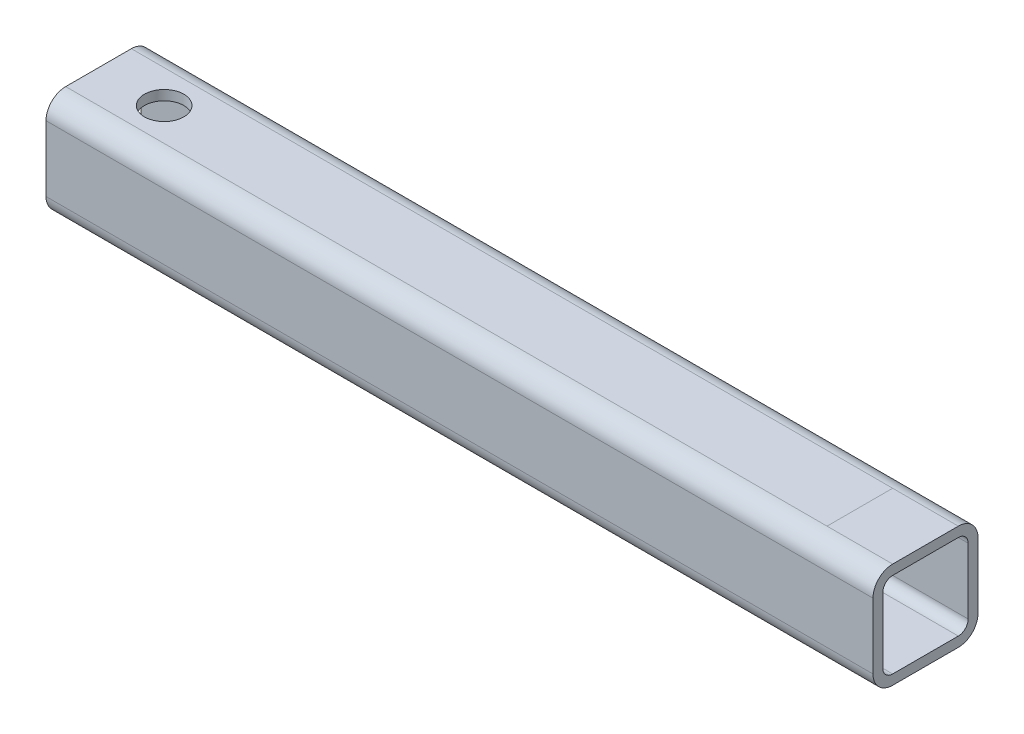
ISO-10303-21;
HEADER;
FILE_DESCRIPTION(('STEP AP214'),'2;1');
FILE_NAME('part.step','',(''),(''),'','','');
FILE_SCHEMA(('AUTOMOTIVE_DESIGN { 1 0 10303 214 1 1 1 1 }'));
ENDSEC;
DATA;
#1=APPLICATION_CONTEXT('core data for automotive mechanical design processes');
#2=APPLICATION_PROTOCOL_DEFINITION('international standard','automotive_design',2000,#1);
#3=PRODUCT_CONTEXT('',#1,'mechanical');
#4=PRODUCT('Part','Part','',(#3));
#5=PRODUCT_RELATED_PRODUCT_CATEGORY('part','',(#4));
#6=PRODUCT_DEFINITION_FORMATION('','',#4);
#7=PRODUCT_DEFINITION_CONTEXT('part definition',#1,'design');
#8=PRODUCT_DEFINITION('design','',#6,#7);
#9=PRODUCT_DEFINITION_SHAPE('','',#8);
#10=(LENGTH_UNIT() NAMED_UNIT(*) SI_UNIT(.MILLI.,.METRE.));
#11=(NAMED_UNIT(*) PLANE_ANGLE_UNIT() SI_UNIT($,.RADIAN.));
#12=(NAMED_UNIT(*) SI_UNIT($,.STERADIAN.) SOLID_ANGLE_UNIT());
#13=UNCERTAINTY_MEASURE_WITH_UNIT(LENGTH_MEASURE(1.E-05),#10,'distance_accuracy_value','');
#14=(GEOMETRIC_REPRESENTATION_CONTEXT(3) GLOBAL_UNCERTAINTY_ASSIGNED_CONTEXT((#13)) GLOBAL_UNIT_ASSIGNED_CONTEXT((#10,
#11,#12)) REPRESENTATION_CONTEXT('',''));
#15=CARTESIAN_POINT('',(0.,0.,0.));
#16=DIRECTION('',(0.,0.,1.));
#17=DIRECTION('',(1.,0.,0.));
#18=AXIS2_PLACEMENT_3D('',#15,#16,#17);
#19=CARTESIAN_POINT('',(400.,25.4,15.875));
#20=DIRECTION('',(0.,-1.,0.));
#21=DIRECTION('',(0.,0.,-1.));
#22=AXIS2_PLACEMENT_3D('',#19,#20,#21);
#23=PLANE('',#22);
#24=CARTESIAN_POINT('',(31.75,25.4,0.));
#25=DIRECTION('',(0.,1.,0.));
#26=DIRECTION('',(0.,0.,1.));
#27=AXIS2_PLACEMENT_3D('',#24,#25,#26);
#28=CIRCLE('',#27,9.525);
#29=CARTESIAN_POINT('',(31.75,25.4,9.525));
#30=VERTEX_POINT('',#29);
#31=EDGE_CURVE('E381',#30,#30,#28,.T.);
#32=ORIENTED_EDGE('',*,*,#31,.F.);
#33=EDGE_LOOP('',(#32));
#34=FACE_BOUND('',#33,.T.);
#35=DIRECTION('',(0.,0.,1.));
#36=VECTOR('',#35,1.);
#37=CARTESIAN_POINT('',(368.25,25.4,15.875));
#38=LINE('',#37,#36);
#39=CARTESIAN_POINT('',(368.25,25.4,-15.875));
#40=VERTEX_POINT('',#39);
#41=CARTESIAN_POINT('',(368.25,25.4,15.875));
#42=VERTEX_POINT('',#41);
#43=EDGE_CURVE('E13',#40,#42,#38,.T.);
#44=ORIENTED_EDGE('',*,*,#43,.F.);
#45=DIRECTION('',(-1.,0.,0.));
#46=VECTOR('',#45,1.);
#47=CARTESIAN_POINT('',(400.,25.4,-15.875));
#48=LINE('',#47,#46);
#49=CARTESIAN_POINT('',(0.,25.4,-15.875));
#50=VERTEX_POINT('',#49);
#51=EDGE_CURVE('E336',#40,#50,#48,.T.);
#52=ORIENTED_EDGE('',*,*,#51,.T.);
#53=DIRECTION('',(0.,0.,1.));
#54=VECTOR('',#53,1.);
#55=CARTESIAN_POINT('',(0.,25.4,15.875));
#56=LINE('',#55,#54);
#57=CARTESIAN_POINT('',(0.,25.4,15.875));
#58=VERTEX_POINT('',#57);
#59=EDGE_CURVE('E221',#50,#58,#56,.T.);
#60=ORIENTED_EDGE('',*,*,#59,.T.);
#61=DIRECTION('',(-1.,0.,0.));
#62=VECTOR('',#61,1.);
#63=CARTESIAN_POINT('',(400.,25.4,15.875));
#64=LINE('',#63,#62);
#65=EDGE_CURVE('E208',#42,#58,#64,.T.);
#66=ORIENTED_EDGE('',*,*,#65,.F.);
#67=EDGE_LOOP('',(#44,#52,#60,#66));
#68=FACE_BOUND('',#67,.T.);
#69=ADVANCED_FACE('F80',(#34,#68),#23,.F.);
#70=CARTESIAN_POINT('',(400.,15.875,15.875));
#71=DIRECTION('',(-1.,0.,0.));
#72=DIRECTION('',(0.,0.,1.));
#73=AXIS2_PLACEMENT_3D('',#70,#71,#72);
#74=CYLINDRICAL_SURFACE('',#73,9.525);
#75=CARTESIAN_POINT('',(0.,15.875,15.875));
#76=DIRECTION('',(1.,0.,0.));
#77=DIRECTION('',(0.,0.,-1.));
#78=AXIS2_PLACEMENT_3D('',#75,#76,#77);
#79=CIRCLE('',#78,9.525);
#80=CARTESIAN_POINT('',(0.,15.875,25.4));
#81=VERTEX_POINT('',#80);
#82=EDGE_CURVE('E306',#58,#81,#79,.T.);
#83=ORIENTED_EDGE('',*,*,#82,.T.);
#84=DIRECTION('',(-1.,0.,0.));
#85=VECTOR('',#84,1.);
#86=CARTESIAN_POINT('',(400.,15.875,25.4));
#87=LINE('',#86,#85);
#88=CARTESIAN_POINT('',(400.,15.875,25.4));
#89=VERTEX_POINT('',#88);
#90=EDGE_CURVE('E89',#89,#81,#87,.T.);
#91=ORIENTED_EDGE('',*,*,#90,.F.);
#92=CARTESIAN_POINT('',(400.,15.875,15.875));
#93=DIRECTION('',(1.,0.,0.));
#94=DIRECTION('',(0.,0.,-1.));
#95=AXIS2_PLACEMENT_3D('',#92,#93,#94);
#96=CIRCLE('',#95,9.525);
#97=CARTESIAN_POINT('',(400.,25.4,15.875));
#98=VERTEX_POINT('',#97);
#99=EDGE_CURVE('E250',#98,#89,#96,.T.);
#100=ORIENTED_EDGE('',*,*,#99,.F.);
#101=EDGE_CURVE('E332',#98,#42,#64,.T.);
#102=ORIENTED_EDGE('',*,*,#101,.T.);
#103=ORIENTED_EDGE('',*,*,#65,.T.);
#104=EDGE_LOOP('',(#83,#91,#100,#102,#103));
#105=FACE_BOUND('',#104,.T.);
#106=ADVANCED_FACE('F431',(#105),#74,.T.);
#107=CARTESIAN_POINT('',(400.,15.875,25.4));
#108=DIRECTION('',(0.,0.,-1.));
#109=DIRECTION('',(0.,1.,0.));
#110=AXIS2_PLACEMENT_3D('',#107,#108,#109);
#111=PLANE('',#110);
#112=DIRECTION('',(0.,-1.,0.));
#113=VECTOR('',#112,1.);
#114=CARTESIAN_POINT('',(0.,15.875,25.4));
#115=LINE('',#114,#113);
#116=CARTESIAN_POINT('',(0.,-15.875,25.4));
#117=VERTEX_POINT('',#116);
#118=EDGE_CURVE('E310',#81,#117,#115,.T.);
#119=ORIENTED_EDGE('',*,*,#118,.T.);
#120=DIRECTION('',(-1.,0.,0.));
#121=VECTOR('',#120,1.);
#122=CARTESIAN_POINT('',(400.,-15.875,25.4));
#123=LINE('',#122,#121);
#124=CARTESIAN_POINT('',(400.,-15.875,25.4));
#125=VERTEX_POINT('',#124);
#126=EDGE_CURVE('E356',#125,#117,#123,.T.);
#127=ORIENTED_EDGE('',*,*,#126,.F.);
#128=DIRECTION('',(0.,-1.,0.));
#129=VECTOR('',#128,1.);
#130=CARTESIAN_POINT('',(400.,15.875,25.4));
#131=LINE('',#130,#129);
#132=EDGE_CURVE('E254',#89,#125,#131,.T.);
#133=ORIENTED_EDGE('',*,*,#132,.F.);
#134=ORIENTED_EDGE('',*,*,#90,.T.);
#135=EDGE_LOOP('',(#119,#127,#133,#134));
#136=FACE_BOUND('',#135,.T.);
#137=ADVANCED_FACE('F437',(#136),#111,.F.);
#138=CARTESIAN_POINT('',(400.,-15.875,15.875));
#139=DIRECTION('',(-1.,0.,0.));
#140=DIRECTION('',(0.,0.,1.));
#141=AXIS2_PLACEMENT_3D('',#138,#139,#140);
#142=CYLINDRICAL_SURFACE('',#141,9.525);
#143=CARTESIAN_POINT('',(0.,-15.875,15.875));
#144=DIRECTION('',(1.,0.,0.));
#145=DIRECTION('',(0.,0.,-1.));
#146=AXIS2_PLACEMENT_3D('',#143,#144,#145);
#147=CIRCLE('',#146,9.525);
#148=CARTESIAN_POINT('',(0.,-25.4,15.875));
#149=VERTEX_POINT('',#148);
#150=EDGE_CURVE('E313',#117,#149,#147,.T.);
#151=ORIENTED_EDGE('',*,*,#150,.T.);
#152=DIRECTION('',(-1.,0.,0.));
#153=VECTOR('',#152,1.);
#154=CARTESIAN_POINT('',(400.,-25.4,15.875));
#155=LINE('',#154,#153);
#156=CARTESIAN_POINT('',(400.,-25.4,15.875));
#157=VERTEX_POINT('',#156);
#158=EDGE_CURVE('E352',#157,#149,#155,.T.);
#159=ORIENTED_EDGE('',*,*,#158,.F.);
#160=CARTESIAN_POINT('',(400.,-15.875,15.875));
#161=DIRECTION('',(1.,0.,0.));
#162=DIRECTION('',(0.,0.,-1.));
#163=AXIS2_PLACEMENT_3D('',#160,#161,#162);
#164=CIRCLE('',#163,9.525);
#165=EDGE_CURVE('E257',#125,#157,#164,.T.);
#166=ORIENTED_EDGE('',*,*,#165,.F.);
#167=ORIENTED_EDGE('',*,*,#126,.T.);
#168=EDGE_LOOP('',(#151,#159,#166,#167));
#169=FACE_BOUND('',#168,.T.);
#170=ADVANCED_FACE('F482',(#169),#142,.T.);
#171=CARTESIAN_POINT('',(400.,-25.4,-15.875));
#172=DIRECTION('',(0.,1.,0.));
#173=DIRECTION('',(0.,0.,1.));
#174=AXIS2_PLACEMENT_3D('',#171,#172,#173);
#175=PLANE('',#174);
#176=CARTESIAN_POINT('',(31.75,-25.4,0.));
#177=DIRECTION('',(0.,1.,0.));
#178=DIRECTION('',(0.,0.,1.));
#179=AXIS2_PLACEMENT_3D('',#176,#177,#178);
#180=CIRCLE('',#179,9.525);
#181=CARTESIAN_POINT('',(31.75,-25.4,9.525));
#182=VERTEX_POINT('',#181);
#183=EDGE_CURVE('E380',#182,#182,#180,.T.);
#184=ORIENTED_EDGE('',*,*,#183,.T.);
#185=EDGE_LOOP('',(#184));
#186=FACE_BOUND('',#185,.T.);
#187=DIRECTION('',(0.,0.,-1.));
#188=VECTOR('',#187,1.);
#189=CARTESIAN_POINT('',(0.,-25.4,-15.875));
#190=LINE('',#189,#188);
#191=CARTESIAN_POINT('',(0.,-25.4,-15.875));
#192=VERTEX_POINT('',#191);
#193=EDGE_CURVE('E316',#149,#192,#190,.T.);
#194=ORIENTED_EDGE('',*,*,#193,.T.);
#195=DIRECTION('',(-1.,0.,0.));
#196=VECTOR('',#195,1.);
#197=CARTESIAN_POINT('',(400.,-25.4,-15.875));
#198=LINE('',#197,#196);
#199=CARTESIAN_POINT('',(400.,-25.4,-15.875));
#200=VERTEX_POINT('',#199);
#201=EDGE_CURVE('E348',#200,#192,#198,.T.);
#202=ORIENTED_EDGE('',*,*,#201,.F.);
#203=DIRECTION('',(0.,0.,-1.));
#204=VECTOR('',#203,1.);
#205=CARTESIAN_POINT('',(400.,-25.4,-15.875));
#206=LINE('',#205,#204);
#207=EDGE_CURVE('E260',#157,#200,#206,.T.);
#208=ORIENTED_EDGE('',*,*,#207,.F.);
#209=ORIENTED_EDGE('',*,*,#158,.T.);
#210=EDGE_LOOP('',(#194,#202,#208,#209));
#211=FACE_BOUND('',#210,.T.);
#212=ADVANCED_FACE('F478',(#186,#211),#175,.F.);
#213=CARTESIAN_POINT('',(400.,-15.875,-15.875));
#214=DIRECTION('',(-1.,0.,0.));
#215=DIRECTION('',(0.,0.,1.));
#216=AXIS2_PLACEMENT_3D('',#213,#214,#215);
#217=CYLINDRICAL_SURFACE('',#216,9.52499999999999);
#218=CARTESIAN_POINT('',(0.,-15.875,-15.875));
#219=DIRECTION('',(1.,0.,0.));
#220=DIRECTION('',(0.,0.,-1.));
#221=AXIS2_PLACEMENT_3D('',#218,#219,#220);
#222=CIRCLE('',#221,9.52499999999999);
#223=CARTESIAN_POINT('',(0.,-15.875,-25.4));
#224=VERTEX_POINT('',#223);
#225=EDGE_CURVE('E319',#192,#224,#222,.T.);
#226=ORIENTED_EDGE('',*,*,#225,.T.);
#227=DIRECTION('',(-1.,0.,0.));
#228=VECTOR('',#227,1.);
#229=CARTESIAN_POINT('',(400.,-15.875,-25.4));
#230=LINE('',#229,#228);
#231=CARTESIAN_POINT('',(400.,-15.875,-25.4));
#232=VERTEX_POINT('',#231);
#233=EDGE_CURVE('E344',#232,#224,#230,.T.);
#234=ORIENTED_EDGE('',*,*,#233,.F.);
#235=CARTESIAN_POINT('',(400.,-15.875,-15.875));
#236=DIRECTION('',(1.,0.,0.));
#237=DIRECTION('',(0.,0.,-1.));
#238=AXIS2_PLACEMENT_3D('',#235,#236,#237);
#239=CIRCLE('',#238,9.52499999999999);
#240=EDGE_CURVE('E263',#200,#232,#239,.T.);
#241=ORIENTED_EDGE('',*,*,#240,.F.);
#242=ORIENTED_EDGE('',*,*,#201,.T.);
#243=EDGE_LOOP('',(#226,#234,#241,#242));
#244=FACE_BOUND('',#243,.T.);
#245=ADVANCED_FACE('F474',(#244),#217,.T.);
#246=CARTESIAN_POINT('',(400.,-15.875,-25.4));
#247=DIRECTION('',(0.,0.,1.));
#248=DIRECTION('',(0.,-1.,0.));
#249=AXIS2_PLACEMENT_3D('',#246,#247,#248);
#250=PLANE('',#249);
#251=DIRECTION('',(0.,1.,0.));
#252=VECTOR('',#251,1.);
#253=CARTESIAN_POINT('',(0.,-15.875,-25.4));
#254=LINE('',#253,#252);
#255=CARTESIAN_POINT('',(0.,15.875,-25.4));
#256=VERTEX_POINT('',#255);
#257=EDGE_CURVE('E322',#224,#256,#254,.T.);
#258=ORIENTED_EDGE('',*,*,#257,.T.);
#259=DIRECTION('',(-1.,0.,0.));
#260=VECTOR('',#259,1.);
#261=CARTESIAN_POINT('',(400.,15.875,-25.4));
#262=LINE('',#261,#260);
#263=CARTESIAN_POINT('',(400.,15.875,-25.4));
#264=VERTEX_POINT('',#263);
#265=EDGE_CURVE('E340',#264,#256,#262,.T.);
#266=ORIENTED_EDGE('',*,*,#265,.F.);
#267=DIRECTION('',(0.,1.,0.));
#268=VECTOR('',#267,1.);
#269=CARTESIAN_POINT('',(400.,-15.875,-25.4));
#270=LINE('',#269,#268);
#271=EDGE_CURVE('E266',#232,#264,#270,.T.);
#272=ORIENTED_EDGE('',*,*,#271,.F.);
#273=ORIENTED_EDGE('',*,*,#233,.T.);
#274=EDGE_LOOP('',(#258,#266,#272,#273));
#275=FACE_BOUND('',#274,.T.);
#276=ADVANCED_FACE('F469',(#275),#250,.F.);
#277=CARTESIAN_POINT('',(400.,15.875,-15.875));
#278=DIRECTION('',(-1.,0.,0.));
#279=DIRECTION('',(0.,0.,1.));
#280=AXIS2_PLACEMENT_3D('',#277,#278,#279);
#281=CYLINDRICAL_SURFACE('',#280,9.525);
#282=CARTESIAN_POINT('',(0.,15.875,-15.875));
#283=DIRECTION('',(1.,0.,0.));
#284=DIRECTION('',(0.,0.,-1.));
#285=AXIS2_PLACEMENT_3D('',#282,#283,#284);
#286=CIRCLE('',#285,9.525);
#287=EDGE_CURVE('E325',#256,#50,#286,.T.);
#288=ORIENTED_EDGE('',*,*,#287,.T.);
#289=ORIENTED_EDGE('',*,*,#51,.F.);
#290=CARTESIAN_POINT('',(400.,25.4,-15.875));
#291=VERTEX_POINT('',#290);
#292=EDGE_CURVE('E337',#291,#40,#48,.T.);
#293=ORIENTED_EDGE('',*,*,#292,.F.);
#294=CARTESIAN_POINT('',(400.,15.875,-15.875));
#295=DIRECTION('',(1.,0.,0.));
#296=DIRECTION('',(0.,0.,-1.));
#297=AXIS2_PLACEMENT_3D('',#294,#295,#296);
#298=CIRCLE('',#297,9.525);
#299=EDGE_CURVE('E269',#264,#291,#298,.T.);
#300=ORIENTED_EDGE('',*,*,#299,.F.);
#301=ORIENTED_EDGE('',*,*,#265,.T.);
#302=EDGE_LOOP('',(#288,#289,#293,#300,#301));
#303=FACE_BOUND('',#302,.T.);
#304=ADVANCED_FACE('F454',(#303),#281,.T.);
#305=CARTESIAN_POINT('',(400.,-15.875,15.875));
#306=DIRECTION('',(-1.,0.,0.));
#307=DIRECTION('',(0.,0.,1.));
#308=AXIS2_PLACEMENT_3D('',#305,#306,#307);
#309=CYLINDRICAL_SURFACE('',#308,4.7625);
#310=CARTESIAN_POINT('',(0.,-15.875,15.875));
#311=DIRECTION('',(1.,0.,0.));
#312=DIRECTION('',(0.,0.,-1.));
#313=AXIS2_PLACEMENT_3D('',#310,#311,#312);
#314=CIRCLE('',#313,4.7625);
#315=CARTESIAN_POINT('',(0.,-15.875,20.6375));
#316=VERTEX_POINT('',#315);
#317=CARTESIAN_POINT('',(0.,-20.6375,15.875));
#318=VERTEX_POINT('',#317);
#319=EDGE_CURVE('E202',#316,#318,#314,.T.);
#320=ORIENTED_EDGE('',*,*,#319,.F.);
#321=DIRECTION('',(-1.,0.,0.));
#322=VECTOR('',#321,1.);
#323=CARTESIAN_POINT('',(400.,-15.875,20.6375));
#324=LINE('',#323,#322);
#325=CARTESIAN_POINT('',(400.,-15.875,20.6375));
#326=VERTEX_POINT('',#325);
#327=EDGE_CURVE('E197',#326,#316,#324,.T.);
#328=ORIENTED_EDGE('',*,*,#327,.F.);
#329=CARTESIAN_POINT('',(400.,-15.875,15.875));
#330=DIRECTION('',(1.,0.,0.));
#331=DIRECTION('',(0.,0.,-1.));
#332=AXIS2_PLACEMENT_3D('',#329,#330,#331);
#333=CIRCLE('',#332,4.7625);
#334=CARTESIAN_POINT('',(400.,-20.6375,15.875));
#335=VERTEX_POINT('',#334);
#336=EDGE_CURVE('E199',#326,#335,#333,.T.);
#337=ORIENTED_EDGE('',*,*,#336,.T.);
#338=DIRECTION('',(-1.,0.,0.));
#339=VECTOR('',#338,1.);
#340=CARTESIAN_POINT('',(400.,-20.6375,15.875));
#341=LINE('',#340,#339);
#342=EDGE_CURVE('E275',#335,#318,#341,.T.);
#343=ORIENTED_EDGE('',*,*,#342,.T.);
#344=EDGE_LOOP('',(#320,#328,#337,#343));
#345=FACE_BOUND('',#344,.T.);
#346=ADVANCED_FACE('F82',(#345),#309,.F.);
#347=CARTESIAN_POINT('',(400.,15.875,20.6375));
#348=DIRECTION('',(0.,0.,-1.));
#349=DIRECTION('',(0.,1.,0.));
#350=AXIS2_PLACEMENT_3D('',#347,#348,#349);
#351=PLANE('',#350);
#352=DIRECTION('',(0.,-1.,0.));
#353=VECTOR('',#352,1.);
#354=CARTESIAN_POINT('',(0.,15.875,20.6375));
#355=LINE('',#354,#353);
#356=CARTESIAN_POINT('',(0.,15.875,20.6375));
#357=VERTEX_POINT('',#356);
#358=EDGE_CURVE('E278',#357,#316,#355,.T.);
#359=ORIENTED_EDGE('',*,*,#358,.F.);
#360=DIRECTION('',(-1.,0.,0.));
#361=VECTOR('',#360,1.);
#362=CARTESIAN_POINT('',(400.,15.875,20.6375));
#363=LINE('',#362,#361);
#364=CARTESIAN_POINT('',(400.,15.875,20.6375));
#365=VERTEX_POINT('',#364);
#366=EDGE_CURVE('E209',#365,#357,#363,.T.);
#367=ORIENTED_EDGE('',*,*,#366,.F.);
#368=DIRECTION('',(0.,-1.,0.));
#369=VECTOR('',#368,1.);
#370=CARTESIAN_POINT('',(400.,15.875,20.6375));
#371=LINE('',#370,#369);
#372=EDGE_CURVE('E215',#365,#326,#371,.T.);
#373=ORIENTED_EDGE('',*,*,#372,.T.);
#374=ORIENTED_EDGE('',*,*,#327,.T.);
#375=EDGE_LOOP('',(#359,#367,#373,#374));
#376=FACE_BOUND('',#375,.T.);
#377=ADVANCED_FACE('F223',(#376),#351,.T.);
#378=CARTESIAN_POINT('',(400.,15.875,15.875));
#379=DIRECTION('',(-1.,0.,0.));
#380=DIRECTION('',(0.,0.,1.));
#381=AXIS2_PLACEMENT_3D('',#378,#379,#380);
#382=CYLINDRICAL_SURFACE('',#381,4.7625);
#383=CARTESIAN_POINT('',(0.,15.875,15.875));
#384=DIRECTION('',(1.,0.,0.));
#385=DIRECTION('',(0.,0.,-1.));
#386=AXIS2_PLACEMENT_3D('',#383,#384,#385);
#387=CIRCLE('',#386,4.7625);
#388=CARTESIAN_POINT('',(0.,20.6375,15.875));
#389=VERTEX_POINT('',#388);
#390=EDGE_CURVE('E282',#389,#357,#387,.T.);
#391=ORIENTED_EDGE('',*,*,#390,.F.);
#392=DIRECTION('',(-1.,0.,0.));
#393=VECTOR('',#392,1.);
#394=CARTESIAN_POINT('',(400.,20.6375,15.875));
#395=LINE('',#394,#393);
#396=CARTESIAN_POINT('',(400.,20.6375,15.875));
#397=VERTEX_POINT('',#396);
#398=EDGE_CURVE('E398',#397,#389,#395,.T.);
#399=ORIENTED_EDGE('',*,*,#398,.F.);
#400=CARTESIAN_POINT('',(400.,15.875,15.875));
#401=DIRECTION('',(1.,0.,0.));
#402=DIRECTION('',(0.,0.,-1.));
#403=AXIS2_PLACEMENT_3D('',#400,#401,#402);
#404=CIRCLE('',#403,4.7625);
#405=EDGE_CURVE('E225',#397,#365,#404,.T.);
#406=ORIENTED_EDGE('',*,*,#405,.T.);
#407=ORIENTED_EDGE('',*,*,#366,.T.);
#408=EDGE_LOOP('',(#391,#399,#406,#407));
#409=FACE_BOUND('',#408,.T.);
#410=ADVANCED_FACE('F393',(#409),#382,.F.);
#411=CARTESIAN_POINT('',(400.,20.6375,15.875));
#412=DIRECTION('',(0.,-1.,0.));
#413=DIRECTION('',(0.,0.,-1.));
#414=AXIS2_PLACEMENT_3D('',#411,#412,#413);
#415=PLANE('',#414);
#416=CARTESIAN_POINT('',(31.75,20.6375,0.));
#417=DIRECTION('',(0.,-1.,0.));
#418=DIRECTION('',(0.,0.,-1.));
#419=AXIS2_PLACEMENT_3D('',#416,#417,#418);
#420=CIRCLE('',#419,9.525);
#421=CARTESIAN_POINT('',(31.75,20.6375,9.525));
#422=VERTEX_POINT('',#421);
#423=EDGE_CURVE('E279',#422,#422,#420,.T.);
#424=ORIENTED_EDGE('',*,*,#423,.F.);
#425=EDGE_LOOP('',(#424));
#426=FACE_BOUND('',#425,.T.);
#427=DIRECTION('',(0.,0.,1.));
#428=VECTOR('',#427,1.);
#429=CARTESIAN_POINT('',(0.,20.6375,15.875));
#430=LINE('',#429,#428);
#431=CARTESIAN_POINT('',(0.,20.6375,-15.875));
#432=VERTEX_POINT('',#431);
#433=EDGE_CURVE('E286',#432,#389,#430,.T.);
#434=ORIENTED_EDGE('',*,*,#433,.F.);
#435=DIRECTION('',(-1.,0.,0.));
#436=VECTOR('',#435,1.);
#437=CARTESIAN_POINT('',(400.,20.6375,-15.875));
#438=LINE('',#437,#436);
#439=CARTESIAN_POINT('',(400.,20.6375,-15.875));
#440=VERTEX_POINT('',#439);
#441=EDGE_CURVE('E396',#440,#432,#438,.T.);
#442=ORIENTED_EDGE('',*,*,#441,.F.);
#443=DIRECTION('',(0.,0.,1.));
#444=VECTOR('',#443,1.);
#445=CARTESIAN_POINT('',(400.,20.6375,15.875));
#446=LINE('',#445,#444);
#447=EDGE_CURVE('E230',#440,#397,#446,.T.);
#448=ORIENTED_EDGE('',*,*,#447,.T.);
#449=ORIENTED_EDGE('',*,*,#398,.T.);
#450=EDGE_LOOP('',(#434,#442,#448,#449));
#451=FACE_BOUND('',#450,.T.);
#452=ADVANCED_FACE('F389',(#426,#451),#415,.T.);
#453=CARTESIAN_POINT('',(400.,15.875,-15.875));
#454=DIRECTION('',(-1.,0.,0.));
#455=DIRECTION('',(0.,0.,1.));
#456=AXIS2_PLACEMENT_3D('',#453,#454,#455);
#457=CYLINDRICAL_SURFACE('',#456,4.7625);
#458=CARTESIAN_POINT('',(0.,15.875,-15.875));
#459=DIRECTION('',(1.,0.,0.));
#460=DIRECTION('',(0.,0.,-1.));
#461=AXIS2_PLACEMENT_3D('',#458,#459,#460);
#462=CIRCLE('',#461,4.7625);
#463=CARTESIAN_POINT('',(0.,15.875,-20.6375));
#464=VERTEX_POINT('',#463);
#465=EDGE_CURVE('E290',#464,#432,#462,.T.);
#466=ORIENTED_EDGE('',*,*,#465,.F.);
#467=DIRECTION('',(-1.,0.,0.));
#468=VECTOR('',#467,1.);
#469=CARTESIAN_POINT('',(400.,15.875,-20.6375));
#470=LINE('',#469,#468);
#471=CARTESIAN_POINT('',(400.,15.875,-20.6375));
#472=VERTEX_POINT('',#471);
#473=EDGE_CURVE('E372',#472,#464,#470,.T.);
#474=ORIENTED_EDGE('',*,*,#473,.F.);
#475=CARTESIAN_POINT('',(400.,15.875,-15.875));
#476=DIRECTION('',(1.,0.,0.));
#477=DIRECTION('',(0.,0.,-1.));
#478=AXIS2_PLACEMENT_3D('',#475,#476,#477);
#479=CIRCLE('',#478,4.7625);
#480=EDGE_CURVE('E237',#472,#440,#479,.T.);
#481=ORIENTED_EDGE('',*,*,#480,.T.);
#482=ORIENTED_EDGE('',*,*,#441,.T.);
#483=EDGE_LOOP('',(#466,#474,#481,#482));
#484=FACE_BOUND('',#483,.T.);
#485=ADVANCED_FACE('F392',(#484),#457,.F.);
#486=CARTESIAN_POINT('',(400.,-15.875,-20.6375));
#487=DIRECTION('',(0.,0.,1.));
#488=DIRECTION('',(0.,-1.,0.));
#489=AXIS2_PLACEMENT_3D('',#486,#487,#488);
#490=PLANE('',#489);
#491=DIRECTION('',(0.,1.,0.));
#492=VECTOR('',#491,1.);
#493=CARTESIAN_POINT('',(0.,-15.875,-20.6375));
#494=LINE('',#493,#492);
#495=CARTESIAN_POINT('',(0.,-15.875,-20.6375));
#496=VERTEX_POINT('',#495);
#497=EDGE_CURVE('E294',#496,#464,#494,.T.);
#498=ORIENTED_EDGE('',*,*,#497,.F.);
#499=DIRECTION('',(-1.,0.,0.));
#500=VECTOR('',#499,1.);
#501=CARTESIAN_POINT('',(400.,-15.875,-20.6375));
#502=LINE('',#501,#500);
#503=CARTESIAN_POINT('',(400.,-15.875,-20.6375));
#504=VERTEX_POINT('',#503);
#505=EDGE_CURVE('E368',#504,#496,#502,.T.);
#506=ORIENTED_EDGE('',*,*,#505,.F.);
#507=DIRECTION('',(0.,1.,0.));
#508=VECTOR('',#507,1.);
#509=CARTESIAN_POINT('',(400.,-15.875,-20.6375));
#510=LINE('',#509,#508);
#511=EDGE_CURVE('E241',#504,#472,#510,.T.);
#512=ORIENTED_EDGE('',*,*,#511,.T.);
#513=ORIENTED_EDGE('',*,*,#473,.T.);
#514=EDGE_LOOP('',(#498,#506,#512,#513));
#515=FACE_BOUND('',#514,.T.);
#516=ADVANCED_FACE('F422',(#515),#490,.T.);
#517=CARTESIAN_POINT('',(400.,-15.875,-15.875));
#518=DIRECTION('',(-1.,0.,0.));
#519=DIRECTION('',(0.,0.,1.));
#520=AXIS2_PLACEMENT_3D('',#517,#518,#519);
#521=CYLINDRICAL_SURFACE('',#520,4.7625);
#522=CARTESIAN_POINT('',(0.,-15.875,-15.875));
#523=DIRECTION('',(1.,0.,0.));
#524=DIRECTION('',(0.,0.,-1.));
#525=AXIS2_PLACEMENT_3D('',#522,#523,#524);
#526=CIRCLE('',#525,4.7625);
#527=CARTESIAN_POINT('',(0.,-20.6375,-15.875));
#528=VERTEX_POINT('',#527);
#529=EDGE_CURVE('E298',#528,#496,#526,.T.);
#530=ORIENTED_EDGE('',*,*,#529,.F.);
#531=DIRECTION('',(-1.,0.,0.));
#532=VECTOR('',#531,1.);
#533=CARTESIAN_POINT('',(400.,-20.6375,-15.875));
#534=LINE('',#533,#532);
#535=CARTESIAN_POINT('',(400.,-20.6375,-15.875));
#536=VERTEX_POINT('',#535);
#537=EDGE_CURVE('E365',#536,#528,#534,.T.);
#538=ORIENTED_EDGE('',*,*,#537,.F.);
#539=CARTESIAN_POINT('',(400.,-15.875,-15.875));
#540=DIRECTION('',(1.,0.,0.));
#541=DIRECTION('',(0.,0.,-1.));
#542=AXIS2_PLACEMENT_3D('',#539,#540,#541);
#543=CIRCLE('',#542,4.7625);
#544=EDGE_CURVE('E245',#536,#504,#543,.T.);
#545=ORIENTED_EDGE('',*,*,#544,.T.);
#546=ORIENTED_EDGE('',*,*,#505,.T.);
#547=EDGE_LOOP('',(#530,#538,#545,#546));
#548=FACE_BOUND('',#547,.T.);
#549=ADVANCED_FACE('F419',(#548),#521,.F.);
#550=CARTESIAN_POINT('',(400.,-20.6375,-15.875));
#551=DIRECTION('',(0.,1.,0.));
#552=DIRECTION('',(0.,0.,1.));
#553=AXIS2_PLACEMENT_3D('',#550,#551,#552);
#554=PLANE('',#553);
#555=CARTESIAN_POINT('',(31.75,-20.6375,0.));
#556=DIRECTION('',(0.,1.,0.));
#557=DIRECTION('',(0.,0.,1.));
#558=AXIS2_PLACEMENT_3D('',#555,#556,#557);
#559=CIRCLE('',#558,9.525);
#560=CARTESIAN_POINT('',(31.75,-20.6375,9.525));
#561=VERTEX_POINT('',#560);
#562=EDGE_CURVE('E376',#561,#561,#559,.T.);
#563=ORIENTED_EDGE('',*,*,#562,.F.);
#564=EDGE_LOOP('',(#563));
#565=FACE_BOUND('',#564,.T.);
#566=DIRECTION('',(0.,0.,-1.));
#567=VECTOR('',#566,1.);
#568=CARTESIAN_POINT('',(0.,-20.6375,-15.875));
#569=LINE('',#568,#567);
#570=EDGE_CURVE('E302',#318,#528,#569,.T.);
#571=ORIENTED_EDGE('',*,*,#570,.F.);
#572=ORIENTED_EDGE('',*,*,#342,.F.);
#573=DIRECTION('',(0.,0.,-1.));
#574=VECTOR('',#573,1.);
#575=CARTESIAN_POINT('',(400.,-20.6375,-15.875));
#576=LINE('',#575,#574);
#577=EDGE_CURVE('E219',#335,#536,#576,.T.);
#578=ORIENTED_EDGE('',*,*,#577,.T.);
#579=ORIENTED_EDGE('',*,*,#537,.T.);
#580=EDGE_LOOP('',(#571,#572,#578,#579));
#581=FACE_BOUND('',#580,.T.);
#582=ADVANCED_FACE('F416',(#565,#581),#554,.T.);
#583=ORIENTED_EDGE('',*,*,#292,.T.);
#584=ORIENTED_EDGE('',*,*,#43,.T.);
#585=ORIENTED_EDGE('',*,*,#101,.F.);
#586=DIRECTION('',(0.,0.,1.));
#587=VECTOR('',#586,1.);
#588=CARTESIAN_POINT('',(400.,25.4,15.875));
#589=LINE('',#588,#587);
#590=EDGE_CURVE('E272',#291,#98,#589,.T.);
#591=ORIENTED_EDGE('',*,*,#590,.F.);
#592=EDGE_LOOP('',(#583,#584,#585,#591));
#593=FACE_BOUND('',#592,.T.);
#594=ADVANCED_FACE('F434',(#593),#23,.F.);
#595=CARTESIAN_POINT('',(400.,15.875,15.875));
#596=DIRECTION('',(1.,0.,0.));
#597=DIRECTION('',(0.,0.,-1.));
#598=AXIS2_PLACEMENT_3D('',#595,#596,#597);
#599=PLANE('',#598);
#600=ORIENTED_EDGE('',*,*,#336,.F.);
#601=ORIENTED_EDGE('',*,*,#372,.F.);
#602=ORIENTED_EDGE('',*,*,#405,.F.);
#603=ORIENTED_EDGE('',*,*,#447,.F.);
#604=ORIENTED_EDGE('',*,*,#480,.F.);
#605=ORIENTED_EDGE('',*,*,#511,.F.);
#606=ORIENTED_EDGE('',*,*,#544,.F.);
#607=ORIENTED_EDGE('',*,*,#577,.F.);
#608=EDGE_LOOP('',(#600,#601,#602,#603,#604,#605,#606,#607));
#609=FACE_BOUND('',#608,.T.);
#610=ORIENTED_EDGE('',*,*,#99,.T.);
#611=ORIENTED_EDGE('',*,*,#132,.T.);
#612=ORIENTED_EDGE('',*,*,#165,.T.);
#613=ORIENTED_EDGE('',*,*,#207,.T.);
#614=ORIENTED_EDGE('',*,*,#240,.T.);
#615=ORIENTED_EDGE('',*,*,#271,.T.);
#616=ORIENTED_EDGE('',*,*,#299,.T.);
#617=ORIENTED_EDGE('',*,*,#590,.T.);
#618=EDGE_LOOP('',(#610,#611,#612,#613,#614,#615,#616,#617));
#619=FACE_BOUND('',#618,.T.);
#620=ADVANCED_FACE('F212',(#609,#619),#599,.T.);
#621=CARTESIAN_POINT('',(0.,15.875,15.875));
#622=DIRECTION('',(1.,0.,0.));
#623=DIRECTION('',(0.,0.,-1.));
#624=AXIS2_PLACEMENT_3D('',#621,#622,#623);
#625=PLANE('',#624);
#626=ORIENTED_EDGE('',*,*,#319,.T.);
#627=ORIENTED_EDGE('',*,*,#570,.T.);
#628=ORIENTED_EDGE('',*,*,#529,.T.);
#629=ORIENTED_EDGE('',*,*,#497,.T.);
#630=ORIENTED_EDGE('',*,*,#465,.T.);
#631=ORIENTED_EDGE('',*,*,#433,.T.);
#632=ORIENTED_EDGE('',*,*,#390,.T.);
#633=ORIENTED_EDGE('',*,*,#358,.T.);
#634=EDGE_LOOP('',(#626,#627,#628,#629,#630,#631,#632,#633));
#635=FACE_BOUND('',#634,.T.);
#636=ORIENTED_EDGE('',*,*,#82,.F.);
#637=ORIENTED_EDGE('',*,*,#59,.F.);
#638=ORIENTED_EDGE('',*,*,#287,.F.);
#639=ORIENTED_EDGE('',*,*,#257,.F.);
#640=ORIENTED_EDGE('',*,*,#225,.F.);
#641=ORIENTED_EDGE('',*,*,#193,.F.);
#642=ORIENTED_EDGE('',*,*,#150,.F.);
#643=ORIENTED_EDGE('',*,*,#118,.F.);
#644=EDGE_LOOP('',(#636,#637,#638,#639,#640,#641,#642,#643));
#645=FACE_BOUND('',#644,.T.);
#646=ADVANCED_FACE('F402',(#635,#645),#625,.F.);
#647=CARTESIAN_POINT('',(31.75,-25.4,0.));
#648=DIRECTION('',(0.,1.,0.));
#649=DIRECTION('',(0.,0.,1.));
#650=AXIS2_PLACEMENT_3D('',#647,#648,#649);
#651=CYLINDRICAL_SURFACE('',#650,9.525);
#652=CARTESIAN_POINT('',(31.75,20.6375,9.525));
#653=CARTESIAN_POINT('',(31.75,20.687109375,9.525));
#654=CARTESIAN_POINT('',(31.75,20.73671875,9.525));
#655=CARTESIAN_POINT('',(31.75,20.8359375,9.525));
#656=CARTESIAN_POINT('',(31.75,20.885546875,9.525));
#657=CARTESIAN_POINT('',(31.75,20.984765625,9.525));
#658=CARTESIAN_POINT('',(31.75,21.034375,9.525));
#659=CARTESIAN_POINT('',(31.75,21.13359375,9.525));
#660=CARTESIAN_POINT('',(31.75,21.183203125,9.525));
#661=CARTESIAN_POINT('',(31.75,21.282421875,9.525));
#662=CARTESIAN_POINT('',(31.75,21.33203125,9.525));
#663=CARTESIAN_POINT('',(31.75,21.43125,9.525));
#664=CARTESIAN_POINT('',(31.75,21.480859375,9.525));
#665=CARTESIAN_POINT('',(31.75,21.580078125,9.525));
#666=CARTESIAN_POINT('',(31.75,21.6296875,9.525));
#667=CARTESIAN_POINT('',(31.75,21.72890625,9.525));
#668=CARTESIAN_POINT('',(31.75,21.778515625,9.525));
#669=CARTESIAN_POINT('',(31.75,21.877734375,9.525));
#670=CARTESIAN_POINT('',(31.75,21.92734375,9.525));
#671=CARTESIAN_POINT('',(31.75,22.0265625,9.525));
#672=CARTESIAN_POINT('',(31.75,22.076171875,9.525));
#673=CARTESIAN_POINT('',(31.75,22.175390625,9.525));
#674=CARTESIAN_POINT('',(31.75,22.225,9.525));
#675=CARTESIAN_POINT('',(31.75,22.32421875,9.525));
#676=CARTESIAN_POINT('',(31.75,22.373828125,9.525));
#677=CARTESIAN_POINT('',(31.75,22.473046875,9.525));
#678=CARTESIAN_POINT('',(31.75,22.52265625,9.525));
#679=CARTESIAN_POINT('',(31.75,22.621875,9.525));
#680=CARTESIAN_POINT('',(31.75,22.671484375,9.525));
#681=CARTESIAN_POINT('',(31.75,22.770703125,9.525));
#682=CARTESIAN_POINT('',(31.75,22.8203125,9.525));
#683=CARTESIAN_POINT('',(31.75,22.91953125,9.525));
#684=CARTESIAN_POINT('',(31.75,22.969140625,9.525));
#685=CARTESIAN_POINT('',(31.75,23.068359375,9.525));
#686=CARTESIAN_POINT('',(31.75,23.11796875,9.525));
#687=CARTESIAN_POINT('',(31.75,23.2171875,9.525));
#688=CARTESIAN_POINT('',(31.75,23.266796875,9.525));
#689=CARTESIAN_POINT('',(31.75,23.366015625,9.525));
#690=CARTESIAN_POINT('',(31.75,23.415625,9.525));
#691=CARTESIAN_POINT('',(31.75,23.51484375,9.525));
#692=CARTESIAN_POINT('',(31.75,23.564453125,9.525));
#693=CARTESIAN_POINT('',(31.75,23.663671875,9.525));
#694=CARTESIAN_POINT('',(31.75,23.71328125,9.525));
#695=CARTESIAN_POINT('',(31.75,23.8125,9.525));
#696=CARTESIAN_POINT('',(31.75,23.862109375,9.525));
#697=CARTESIAN_POINT('',(31.75,23.961328125,9.525));
#698=CARTESIAN_POINT('',(31.75,24.0109375,9.525));
#699=CARTESIAN_POINT('',(31.75,24.11015625,9.525));
#700=CARTESIAN_POINT('',(31.75,24.159765625,9.525));
#701=CARTESIAN_POINT('',(31.75,24.258984375,9.525));
#702=CARTESIAN_POINT('',(31.75,24.30859375,9.525));
#703=CARTESIAN_POINT('',(31.75,24.4078125,9.525));
#704=CARTESIAN_POINT('',(31.75,24.457421875,9.525));
#705=CARTESIAN_POINT('',(31.75,24.556640625,9.525));
#706=CARTESIAN_POINT('',(31.75,24.60625,9.525));
#707=CARTESIAN_POINT('',(31.75,24.70546875,9.525));
#708=CARTESIAN_POINT('',(31.75,24.755078125,9.525));
#709=CARTESIAN_POINT('',(31.75,24.854296875,9.525));
#710=CARTESIAN_POINT('',(31.75,24.90390625,9.525));
#711=CARTESIAN_POINT('',(31.75,25.003125,9.525));
#712=CARTESIAN_POINT('',(31.75,25.052734375,9.525));
#713=CARTESIAN_POINT('',(31.75,25.151953125,9.525));
#714=CARTESIAN_POINT('',(31.75,25.2015625,9.525));
#715=CARTESIAN_POINT('',(31.75,25.30078125,9.525));
#716=CARTESIAN_POINT('',(31.75,25.350390625,9.525));
#717=CARTESIAN_POINT('',(31.75,25.4,9.525));
#718=B_SPLINE_CURVE_WITH_KNOTS('',3,(#652,#653,#654,#655,#656,#657,#658,#659,#660,#661,#662,
#663,#664,#665,#666,#667,#668,#669,#670,#671,#672,#673,#674,#675,#676,#677,#678,#679,#680,#681,
#682,#683,#684,#685,#686,#687,#688,#689,#690,#691,#692,#693,#694,#695,#696,#697,#698,#699,#700,
#701,#702,#703,#704,#705,#706,#707,#708,#709,#710,#711,#712,#713,#714,#715,#716,#717),
.UNSPECIFIED.,.F.,.F.,(4,2,2,2,2,2,2,2,2,2,2,2,2,2,2,2,2,2,2,2,2,2,2,2,2,2,2,2,2,2,2,2,4),(0.,
0.148828125,0.29765625,0.446484375,0.5953125,0.744140625,0.892968750000001,1.041796875,1.190625,
1.339453125,1.48828125,1.637109375,1.7859375,1.934765625,2.08359375,2.232421875,2.38125,
2.530078125,2.67890625,2.827734375,2.9765625,3.125390625,3.27421875,3.423046875,3.571875,
3.720703125,3.86953125,4.018359375,4.1671875,4.316015625,4.46484375,4.613671875,4.7625),.UNSPECIFIED.);
#719=EDGE_CURVE('BSEAM386',#422,#30,#718,.T.);
#720=ORIENTED_EDGE('',*,*,#423,.T.);
#721=ORIENTED_EDGE('',*,*,#31,.T.);
#722=ORIENTED_EDGE('',*,*,#719,.T.);
#723=ORIENTED_EDGE('',*,*,#719,.F.);
#724=EDGE_LOOP('',(#720,#722,#721,#723));
#725=FACE_BOUND('',#724,.T.);
#726=ADVANCED_FACE('F386',(#725),#651,.F.);
#727=CARTESIAN_POINT('',(31.75,-20.6375,9.525));
#728=CARTESIAN_POINT('',(31.75,-20.687109375,9.525));
#729=CARTESIAN_POINT('',(31.75,-20.73671875,9.525));
#730=CARTESIAN_POINT('',(31.75,-20.8359375,9.525));
#731=CARTESIAN_POINT('',(31.75,-20.885546875,9.525));
#732=CARTESIAN_POINT('',(31.75,-20.984765625,9.525));
#733=CARTESIAN_POINT('',(31.75,-21.034375,9.525));
#734=CARTESIAN_POINT('',(31.75,-21.13359375,9.525));
#735=CARTESIAN_POINT('',(31.75,-21.183203125,9.525));
#736=CARTESIAN_POINT('',(31.75,-21.282421875,9.525));
#737=CARTESIAN_POINT('',(31.75,-21.33203125,9.525));
#738=CARTESIAN_POINT('',(31.75,-21.43125,9.525));
#739=CARTESIAN_POINT('',(31.75,-21.480859375,9.525));
#740=CARTESIAN_POINT('',(31.75,-21.580078125,9.525));
#741=CARTESIAN_POINT('',(31.75,-21.6296875,9.525));
#742=CARTESIAN_POINT('',(31.75,-21.72890625,9.525));
#743=CARTESIAN_POINT('',(31.75,-21.778515625,9.525));
#744=CARTESIAN_POINT('',(31.75,-21.877734375,9.525));
#745=CARTESIAN_POINT('',(31.75,-21.92734375,9.525));
#746=CARTESIAN_POINT('',(31.75,-22.0265625,9.525));
#747=CARTESIAN_POINT('',(31.75,-22.076171875,9.525));
#748=CARTESIAN_POINT('',(31.75,-22.175390625,9.525));
#749=CARTESIAN_POINT('',(31.75,-22.225,9.525));
#750=CARTESIAN_POINT('',(31.75,-22.32421875,9.525));
#751=CARTESIAN_POINT('',(31.75,-22.373828125,9.525));
#752=CARTESIAN_POINT('',(31.75,-22.473046875,9.525));
#753=CARTESIAN_POINT('',(31.75,-22.52265625,9.525));
#754=CARTESIAN_POINT('',(31.75,-22.621875,9.525));
#755=CARTESIAN_POINT('',(31.75,-22.671484375,9.525));
#756=CARTESIAN_POINT('',(31.75,-22.770703125,9.525));
#757=CARTESIAN_POINT('',(31.75,-22.8203125,9.525));
#758=CARTESIAN_POINT('',(31.75,-22.91953125,9.525));
#759=CARTESIAN_POINT('',(31.75,-22.969140625,9.525));
#760=CARTESIAN_POINT('',(31.75,-23.068359375,9.525));
#761=CARTESIAN_POINT('',(31.75,-23.11796875,9.525));
#762=CARTESIAN_POINT('',(31.75,-23.2171875,9.525));
#763=CARTESIAN_POINT('',(31.75,-23.266796875,9.525));
#764=CARTESIAN_POINT('',(31.75,-23.366015625,9.525));
#765=CARTESIAN_POINT('',(31.75,-23.415625,9.525));
#766=CARTESIAN_POINT('',(31.75,-23.51484375,9.525));
#767=CARTESIAN_POINT('',(31.75,-23.564453125,9.525));
#768=CARTESIAN_POINT('',(31.75,-23.663671875,9.525));
#769=CARTESIAN_POINT('',(31.75,-23.71328125,9.525));
#770=CARTESIAN_POINT('',(31.75,-23.8125,9.525));
#771=CARTESIAN_POINT('',(31.75,-23.862109375,9.525));
#772=CARTESIAN_POINT('',(31.75,-23.961328125,9.525));
#773=CARTESIAN_POINT('',(31.75,-24.0109375,9.525));
#774=CARTESIAN_POINT('',(31.75,-24.11015625,9.525));
#775=CARTESIAN_POINT('',(31.75,-24.159765625,9.525));
#776=CARTESIAN_POINT('',(31.75,-24.258984375,9.525));
#777=CARTESIAN_POINT('',(31.75,-24.30859375,9.525));
#778=CARTESIAN_POINT('',(31.75,-24.4078125,9.525));
#779=CARTESIAN_POINT('',(31.75,-24.457421875,9.525));
#780=CARTESIAN_POINT('',(31.75,-24.556640625,9.525));
#781=CARTESIAN_POINT('',(31.75,-24.60625,9.525));
#782=CARTESIAN_POINT('',(31.75,-24.70546875,9.525));
#783=CARTESIAN_POINT('',(31.75,-24.755078125,9.525));
#784=CARTESIAN_POINT('',(31.75,-24.854296875,9.525));
#785=CARTESIAN_POINT('',(31.75,-24.90390625,9.525));
#786=CARTESIAN_POINT('',(31.75,-25.003125,9.525));
#787=CARTESIAN_POINT('',(31.75,-25.052734375,9.525));
#788=CARTESIAN_POINT('',(31.75,-25.151953125,9.525));
#789=CARTESIAN_POINT('',(31.75,-25.2015625,9.525));
#790=CARTESIAN_POINT('',(31.75,-25.30078125,9.525));
#791=CARTESIAN_POINT('',(31.75,-25.350390625,9.525));
#792=CARTESIAN_POINT('',(31.75,-25.4,9.525));
#793=B_SPLINE_CURVE_WITH_KNOTS('',3,(#727,#728,#729,#730,#731,#732,#733,#734,#735,#736,#737,
#738,#739,#740,#741,#742,#743,#744,#745,#746,#747,#748,#749,#750,#751,#752,#753,#754,#755,#756,
#757,#758,#759,#760,#761,#762,#763,#764,#765,#766,#767,#768,#769,#770,#771,#772,#773,#774,#775,
#776,#777,#778,#779,#780,#781,#782,#783,#784,#785,#786,#787,#788,#789,#790,#791,#792),
.UNSPECIFIED.,.F.,.F.,(4,2,2,2,2,2,2,2,2,2,2,2,2,2,2,2,2,2,2,2,2,2,2,2,2,2,2,2,2,2,2,2,4),(0.,
0.148828125,0.29765625,0.446484375000004,0.595312500000004,0.744140625000004,0.892968750000001,
1.041796875,1.190625,1.339453125,1.48828125,1.637109375,1.7859375,1.934765625,2.08359375,
2.232421875,2.38125,2.53007812500001,2.67890625000001,2.82773437500001,2.97656250000001,
3.12539062500001,3.27421875000001,3.42304687500001,3.57187500000001,3.72070312500001,
3.86953125000001,4.01835937500001,4.16718750000001,4.31601562500001,4.46484375000001,
4.61367187500001,4.76250000000001),.UNSPECIFIED.);
#794=EDGE_CURVE('BSEAM622',#561,#182,#793,.T.);
#795=ORIENTED_EDGE('',*,*,#562,.T.);
#796=ORIENTED_EDGE('',*,*,#183,.F.);
#797=ORIENTED_EDGE('',*,*,#794,.T.);
#798=ORIENTED_EDGE('',*,*,#794,.F.);
#799=EDGE_LOOP('',(#795,#797,#796,#798));
#800=FACE_BOUND('',#799,.T.);
#801=ADVANCED_FACE('F622',(#800),#651,.F.);
#802=CLOSED_SHELL('',(#69,#106,#137,#170,#212,#245,#276,#304,#346,#377,#410,#452,#485,#516,#549,
#582,#594,#620,#646,#726,#801));
#803=MANIFOLD_SOLID_BREP('B2',#802);
#804=ADVANCED_BREP_SHAPE_REPRESENTATION('',(#18,#803),#14);
#805=SHAPE_DEFINITION_REPRESENTATION(#9,#804);
ENDSEC;
END-ISO-10303-21;
